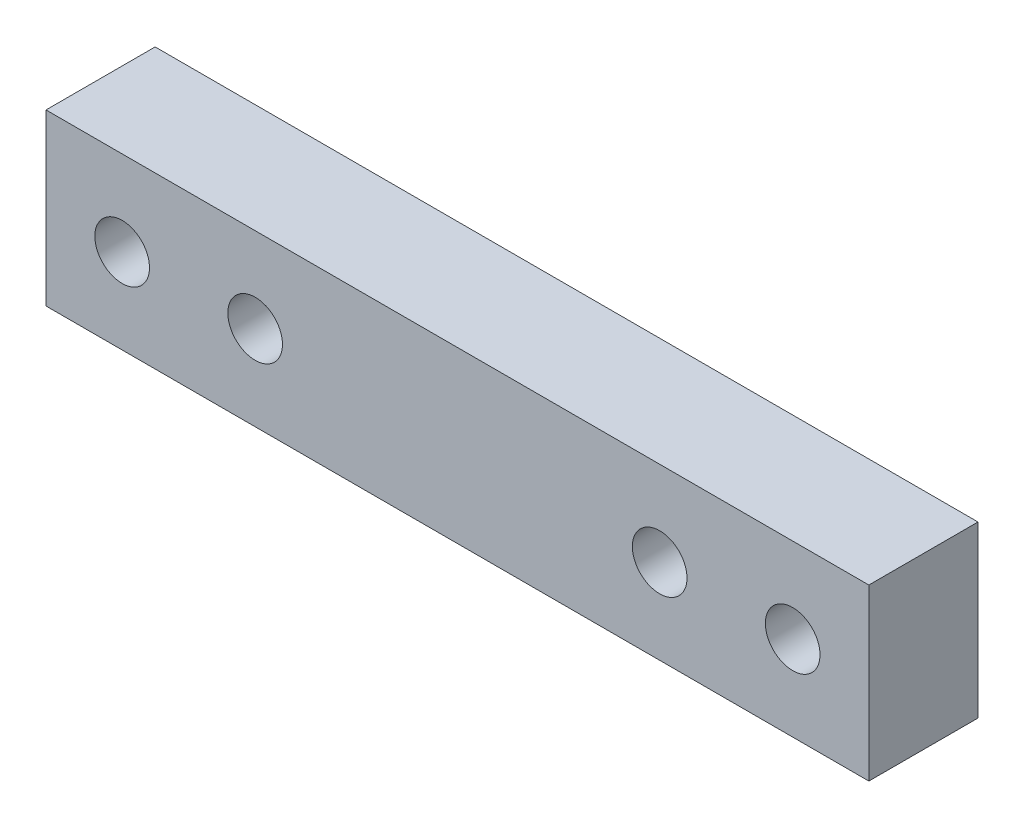
ISO-10303-21;
HEADER;
FILE_DESCRIPTION(('STEP AP214'),'2;1');
FILE_NAME('part.step','',(''),(''),'','','');
FILE_SCHEMA(('AUTOMOTIVE_DESIGN { 1 0 10303 214 1 1 1 1 }'));
ENDSEC;
DATA;
#1=APPLICATION_CONTEXT('core data for automotive mechanical design processes');
#2=APPLICATION_PROTOCOL_DEFINITION('international standard','automotive_design',2000,#1);
#3=PRODUCT_CONTEXT('',#1,'mechanical');
#4=PRODUCT('Part','Part','',(#3));
#5=PRODUCT_RELATED_PRODUCT_CATEGORY('part','',(#4));
#6=PRODUCT_DEFINITION_FORMATION('','',#4);
#7=PRODUCT_DEFINITION_CONTEXT('part definition',#1,'design');
#8=PRODUCT_DEFINITION('design','',#6,#7);
#9=PRODUCT_DEFINITION_SHAPE('','',#8);
#10=(LENGTH_UNIT() NAMED_UNIT(*) SI_UNIT(.MILLI.,.METRE.));
#11=(NAMED_UNIT(*) PLANE_ANGLE_UNIT() SI_UNIT($,.RADIAN.));
#12=(NAMED_UNIT(*) SI_UNIT($,.STERADIAN.) SOLID_ANGLE_UNIT());
#13=UNCERTAINTY_MEASURE_WITH_UNIT(LENGTH_MEASURE(1.E-05),#10,'distance_accuracy_value','');
#14=(GEOMETRIC_REPRESENTATION_CONTEXT(3) GLOBAL_UNCERTAINTY_ASSIGNED_CONTEXT((#13)) GLOBAL_UNIT_ASSIGNED_CONTEXT((#10,
#11,#12)) REPRESENTATION_CONTEXT('',''));
#15=CARTESIAN_POINT('',(0.,0.,0.));
#16=DIRECTION('',(0.,0.,1.));
#17=DIRECTION('',(1.,0.,0.));
#18=AXIS2_PLACEMENT_3D('',#15,#16,#17);
#19=CARTESIAN_POINT('',(0.,0.,5.99));
#20=DIRECTION('',(0.,0.,-1.));
#21=DIRECTION('',(-1.,0.,0.));
#22=AXIS2_PLACEMENT_3D('',#19,#20,#21);
#23=PLANE('',#22);
#24=DIRECTION('',(0.,-1.,0.));
#25=VECTOR('',#24,1.);
#26=CARTESIAN_POINT('',(0.,0.,5.99));
#27=LINE('',#26,#25);
#28=CARTESIAN_POINT('',(0.,9.32,5.99));
#29=VERTEX_POINT('',#28);
#30=CARTESIAN_POINT('',(0.,0.,5.99));
#31=VERTEX_POINT('',#30);
#32=EDGE_CURVE('E85',#29,#31,#27,.T.);
#33=ORIENTED_EDGE('',*,*,#32,.T.);
#34=DIRECTION('',(1.,0.,0.));
#35=VECTOR('',#34,1.);
#36=CARTESIAN_POINT('',(0.,0.,5.99));
#37=LINE('',#36,#35);
#38=CARTESIAN_POINT('',(45.16,0.,5.99));
#39=VERTEX_POINT('',#38);
#40=EDGE_CURVE('E80',#31,#39,#37,.T.);
#41=ORIENTED_EDGE('',*,*,#40,.T.);
#42=DIRECTION('',(0.,1.,0.));
#43=VECTOR('',#42,1.);
#44=CARTESIAN_POINT('',(45.16,0.,5.99));
#45=LINE('',#44,#43);
#46=CARTESIAN_POINT('',(45.16,9.32,5.99));
#47=VERTEX_POINT('',#46);
#48=EDGE_CURVE('E83',#39,#47,#45,.T.);
#49=ORIENTED_EDGE('',*,*,#48,.T.);
#50=DIRECTION('',(-1.,0.,0.));
#51=VECTOR('',#50,1.);
#52=CARTESIAN_POINT('',(0.,9.32,5.99));
#53=LINE('',#52,#51);
#54=EDGE_CURVE('E50',#47,#29,#53,.T.);
#55=ORIENTED_EDGE('',*,*,#54,.T.);
#56=EDGE_LOOP('',(#33,#41,#49,#55));
#57=FACE_BOUND('',#56,.T.);
#58=CARTESIAN_POINT('',(4.18,4.66,5.99));
#59=DIRECTION('',(0.,0.,1.));
#60=DIRECTION('',(1.,0.,0.));
#61=AXIS2_PLACEMENT_3D('',#58,#59,#60);
#62=CIRCLE('',#61,1.5);
#63=CARTESIAN_POINT('',(2.68,4.66,5.99));
#64=VERTEX_POINT('',#63);
#65=EDGE_CURVE('E100',#64,#64,#62,.T.);
#66=ORIENTED_EDGE('',*,*,#65,.F.);
#67=EDGE_LOOP('',(#66));
#68=FACE_BOUND('',#67,.T.);
#69=CARTESIAN_POINT('',(11.48,4.66,5.99));
#70=DIRECTION('',(0.,0.,1.));
#71=DIRECTION('',(1.,0.,0.));
#72=AXIS2_PLACEMENT_3D('',#69,#70,#71);
#73=CIRCLE('',#72,1.5);
#74=CARTESIAN_POINT('',(9.98,4.66,5.99));
#75=VERTEX_POINT('',#74);
#76=EDGE_CURVE('E115',#75,#75,#73,.T.);
#77=ORIENTED_EDGE('',*,*,#76,.F.);
#78=EDGE_LOOP('',(#77));
#79=FACE_BOUND('',#78,.T.);
#80=CARTESIAN_POINT('',(40.98,4.66,5.99));
#81=DIRECTION('',(0.,0.,1.));
#82=DIRECTION('',(-1.,0.,0.));
#83=AXIS2_PLACEMENT_3D('',#80,#81,#82);
#84=CIRCLE('',#83,1.5);
#85=CARTESIAN_POINT('',(39.48,4.66,5.99));
#86=VERTEX_POINT('',#85);
#87=EDGE_CURVE('E121',#86,#86,#84,.T.);
#88=ORIENTED_EDGE('',*,*,#87,.F.);
#89=EDGE_LOOP('',(#88));
#90=FACE_BOUND('',#89,.T.);
#91=CARTESIAN_POINT('',(33.68,4.66,5.99));
#92=DIRECTION('',(0.,0.,1.));
#93=DIRECTION('',(-1.,0.,0.));
#94=AXIS2_PLACEMENT_3D('',#91,#92,#93);
#95=CIRCLE('',#94,1.5);
#96=CARTESIAN_POINT('',(32.18,4.66,5.99));
#97=VERTEX_POINT('',#96);
#98=EDGE_CURVE('E127',#97,#97,#95,.T.);
#99=ORIENTED_EDGE('',*,*,#98,.F.);
#100=EDGE_LOOP('',(#99));
#101=FACE_BOUND('',#100,.T.);
#102=ADVANCED_FACE('F33',(#57,#68,#79,#90,#101),#23,.F.);
#103=CARTESIAN_POINT('',(0.,0.,0.));
#104=DIRECTION('',(0.,0.,-1.));
#105=DIRECTION('',(-1.,0.,0.));
#106=AXIS2_PLACEMENT_3D('',#103,#104,#105);
#107=PLANE('',#106);
#108=CARTESIAN_POINT('',(40.98,4.66,0.));
#109=DIRECTION('',(0.,0.,1.));
#110=DIRECTION('',(-1.,0.,0.));
#111=AXIS2_PLACEMENT_3D('',#108,#109,#110);
#112=CIRCLE('',#111,1.5);
#113=CARTESIAN_POINT('',(39.48,4.66,0.));
#114=VERTEX_POINT('',#113);
#115=EDGE_CURVE('E124',#114,#114,#112,.T.);
#116=ORIENTED_EDGE('',*,*,#115,.T.);
#117=EDGE_LOOP('',(#116));
#118=FACE_BOUND('',#117,.T.);
#119=CARTESIAN_POINT('',(4.18,4.66,0.));
#120=DIRECTION('',(0.,0.,1.));
#121=DIRECTION('',(1.,0.,0.));
#122=AXIS2_PLACEMENT_3D('',#119,#120,#121);
#123=CIRCLE('',#122,1.5);
#124=CARTESIAN_POINT('',(2.68,4.66,0.));
#125=VERTEX_POINT('',#124);
#126=EDGE_CURVE('E112',#125,#125,#123,.T.);
#127=ORIENTED_EDGE('',*,*,#126,.T.);
#128=EDGE_LOOP('',(#127));
#129=FACE_BOUND('',#128,.T.);
#130=DIRECTION('',(0.,-1.,0.));
#131=VECTOR('',#130,1.);
#132=CARTESIAN_POINT('',(0.,0.,0.));
#133=LINE('',#132,#131);
#134=CARTESIAN_POINT('',(0.,9.32,0.));
#135=VERTEX_POINT('',#134);
#136=CARTESIAN_POINT('',(0.,0.,0.));
#137=VERTEX_POINT('',#136);
#138=EDGE_CURVE('E97',#135,#137,#133,.T.);
#139=ORIENTED_EDGE('',*,*,#138,.F.);
#140=DIRECTION('',(-1.,0.,0.));
#141=VECTOR('',#140,1.);
#142=CARTESIAN_POINT('',(0.,9.32,0.));
#143=LINE('',#142,#141);
#144=CARTESIAN_POINT('',(45.16,9.32,0.));
#145=VERTEX_POINT('',#144);
#146=EDGE_CURVE('E73',#145,#135,#143,.T.);
#147=ORIENTED_EDGE('',*,*,#146,.F.);
#148=DIRECTION('',(0.,1.,0.));
#149=VECTOR('',#148,1.);
#150=CARTESIAN_POINT('',(45.16,0.,0.));
#151=LINE('',#150,#149);
#152=CARTESIAN_POINT('',(45.16,0.,0.));
#153=VERTEX_POINT('',#152);
#154=EDGE_CURVE('E67',#153,#145,#151,.T.);
#155=ORIENTED_EDGE('',*,*,#154,.F.);
#156=DIRECTION('',(1.,0.,0.));
#157=VECTOR('',#156,1.);
#158=CARTESIAN_POINT('',(0.,0.,0.));
#159=LINE('',#158,#157);
#160=EDGE_CURVE('E89',#137,#153,#159,.T.);
#161=ORIENTED_EDGE('',*,*,#160,.F.);
#162=EDGE_LOOP('',(#139,#147,#155,#161));
#163=FACE_BOUND('',#162,.T.);
#164=CARTESIAN_POINT('',(11.48,4.66,0.));
#165=DIRECTION('',(0.,0.,1.));
#166=DIRECTION('',(1.,0.,0.));
#167=AXIS2_PLACEMENT_3D('',#164,#165,#166);
#168=CIRCLE('',#167,1.5);
#169=CARTESIAN_POINT('',(9.98,4.66,0.));
#170=VERTEX_POINT('',#169);
#171=EDGE_CURVE('E118',#170,#170,#168,.T.);
#172=ORIENTED_EDGE('',*,*,#171,.T.);
#173=EDGE_LOOP('',(#172));
#174=FACE_BOUND('',#173,.T.);
#175=CARTESIAN_POINT('',(33.68,4.66,0.));
#176=DIRECTION('',(0.,0.,1.));
#177=DIRECTION('',(-1.,0.,0.));
#178=AXIS2_PLACEMENT_3D('',#175,#176,#177);
#179=CIRCLE('',#178,1.5);
#180=CARTESIAN_POINT('',(32.18,4.66,0.));
#181=VERTEX_POINT('',#180);
#182=EDGE_CURVE('E130',#181,#181,#179,.T.);
#183=ORIENTED_EDGE('',*,*,#182,.T.);
#184=EDGE_LOOP('',(#183));
#185=FACE_BOUND('',#184,.T.);
#186=ADVANCED_FACE('F108',(#118,#129,#163,#174,#185),#107,.T.);
#187=CARTESIAN_POINT('',(0.,0.,5.99));
#188=DIRECTION('',(1.,0.,0.));
#189=DIRECTION('',(0.,0.,-1.));
#190=AXIS2_PLACEMENT_3D('',#187,#188,#189);
#191=PLANE('',#190);
#192=ORIENTED_EDGE('',*,*,#138,.T.);
#193=DIRECTION('',(0.,0.,-1.));
#194=VECTOR('',#193,1.);
#195=CARTESIAN_POINT('',(0.,0.,5.99));
#196=LINE('',#195,#194);
#197=EDGE_CURVE('E11',#31,#137,#196,.T.);
#198=ORIENTED_EDGE('',*,*,#197,.F.);
#199=ORIENTED_EDGE('',*,*,#32,.F.);
#200=DIRECTION('',(0.,0.,-1.));
#201=VECTOR('',#200,1.);
#202=CARTESIAN_POINT('',(0.,9.32,5.99));
#203=LINE('',#202,#201);
#204=EDGE_CURVE('E93',#29,#135,#203,.T.);
#205=ORIENTED_EDGE('',*,*,#204,.T.);
#206=EDGE_LOOP('',(#192,#198,#199,#205));
#207=FACE_BOUND('',#206,.T.);
#208=ADVANCED_FACE('F35',(#207),#191,.F.);
#209=CARTESIAN_POINT('',(0.,0.,5.99));
#210=DIRECTION('',(0.,1.,0.));
#211=DIRECTION('',(0.,0.,1.));
#212=AXIS2_PLACEMENT_3D('',#209,#210,#211);
#213=PLANE('',#212);
#214=ORIENTED_EDGE('',*,*,#160,.T.);
#215=DIRECTION('',(0.,0.,-1.));
#216=VECTOR('',#215,1.);
#217=CARTESIAN_POINT('',(45.16,0.,5.99));
#218=LINE('',#217,#216);
#219=EDGE_CURVE('E42',#39,#153,#218,.T.);
#220=ORIENTED_EDGE('',*,*,#219,.F.);
#221=ORIENTED_EDGE('',*,*,#40,.F.);
#222=ORIENTED_EDGE('',*,*,#197,.T.);
#223=EDGE_LOOP('',(#214,#220,#221,#222));
#224=FACE_BOUND('',#223,.T.);
#225=ADVANCED_FACE('F88',(#224),#213,.F.);
#226=CARTESIAN_POINT('',(45.16,0.,5.99));
#227=DIRECTION('',(-1.,0.,0.));
#228=DIRECTION('',(0.,0.,1.));
#229=AXIS2_PLACEMENT_3D('',#226,#227,#228);
#230=PLANE('',#229);
#231=ORIENTED_EDGE('',*,*,#154,.T.);
#232=DIRECTION('',(0.,0.,-1.));
#233=VECTOR('',#232,1.);
#234=CARTESIAN_POINT('',(45.16,9.32,5.99));
#235=LINE('',#234,#233);
#236=EDGE_CURVE('E90',#47,#145,#235,.T.);
#237=ORIENTED_EDGE('',*,*,#236,.F.);
#238=ORIENTED_EDGE('',*,*,#48,.F.);
#239=ORIENTED_EDGE('',*,*,#219,.T.);
#240=EDGE_LOOP('',(#231,#237,#238,#239));
#241=FACE_BOUND('',#240,.T.);
#242=ADVANCED_FACE('F91',(#241),#230,.F.);
#243=CARTESIAN_POINT('',(0.,9.32,5.99));
#244=DIRECTION('',(0.,-1.,0.));
#245=DIRECTION('',(0.,0.,-1.));
#246=AXIS2_PLACEMENT_3D('',#243,#244,#245);
#247=PLANE('',#246);
#248=ORIENTED_EDGE('',*,*,#146,.T.);
#249=ORIENTED_EDGE('',*,*,#204,.F.);
#250=ORIENTED_EDGE('',*,*,#54,.F.);
#251=ORIENTED_EDGE('',*,*,#236,.T.);
#252=EDGE_LOOP('',(#248,#249,#250,#251));
#253=FACE_BOUND('',#252,.T.);
#254=ADVANCED_FACE('F105',(#253),#247,.F.);
#255=CARTESIAN_POINT('',(4.18,4.66,5.99));
#256=DIRECTION('',(0.,0.,-1.));
#257=DIRECTION('',(-1.,0.,0.));
#258=AXIS2_PLACEMENT_3D('',#255,#256,#257);
#259=CYLINDRICAL_SURFACE('',#258,1.5);
#260=CARTESIAN_POINT('',(2.68,4.66,5.99));
#261=CARTESIAN_POINT('',(2.68,4.66,5.92760416666667));
#262=CARTESIAN_POINT('',(2.68,4.66,5.86520833333333));
#263=CARTESIAN_POINT('',(2.68,4.66,5.74041666666667));
#264=CARTESIAN_POINT('',(2.68,4.66,5.67802083333333));
#265=CARTESIAN_POINT('',(2.68,4.66,5.55322916666667));
#266=CARTESIAN_POINT('',(2.68,4.66,5.49083333333333));
#267=CARTESIAN_POINT('',(2.68,4.66,5.36604166666667));
#268=CARTESIAN_POINT('',(2.68,4.66,5.30364583333333));
#269=CARTESIAN_POINT('',(2.68,4.66,5.17885416666667));
#270=CARTESIAN_POINT('',(2.68,4.66,5.11645833333333));
#271=CARTESIAN_POINT('',(2.68,4.66,4.99166666666667));
#272=CARTESIAN_POINT('',(2.68,4.66,4.92927083333333));
#273=CARTESIAN_POINT('',(2.68,4.66,4.80447916666667));
#274=CARTESIAN_POINT('',(2.68,4.66,4.74208333333333));
#275=CARTESIAN_POINT('',(2.68,4.66,4.61729166666667));
#276=CARTESIAN_POINT('',(2.68,4.66,4.55489583333333));
#277=CARTESIAN_POINT('',(2.68,4.66,4.43010416666667));
#278=CARTESIAN_POINT('',(2.68,4.66,4.36770833333333));
#279=CARTESIAN_POINT('',(2.68,4.66,4.24291666666667));
#280=CARTESIAN_POINT('',(2.68,4.66,4.18052083333333));
#281=CARTESIAN_POINT('',(2.68,4.66,4.05572916666667));
#282=CARTESIAN_POINT('',(2.68,4.66,3.99333333333333));
#283=CARTESIAN_POINT('',(2.68,4.66,3.86854166666667));
#284=CARTESIAN_POINT('',(2.68,4.66,3.80614583333333));
#285=CARTESIAN_POINT('',(2.68,4.66,3.68135416666667));
#286=CARTESIAN_POINT('',(2.68,4.66,3.61895833333333));
#287=CARTESIAN_POINT('',(2.68,4.66,3.49416666666667));
#288=CARTESIAN_POINT('',(2.68,4.66,3.43177083333333));
#289=CARTESIAN_POINT('',(2.68,4.66,3.30697916666667));
#290=CARTESIAN_POINT('',(2.68,4.66,3.24458333333333));
#291=CARTESIAN_POINT('',(2.68,4.66,3.11979166666667));
#292=CARTESIAN_POINT('',(2.68,4.66,3.05739583333333));
#293=CARTESIAN_POINT('',(2.68,4.66,2.93260416666667));
#294=CARTESIAN_POINT('',(2.68,4.66,2.87020833333333));
#295=CARTESIAN_POINT('',(2.68,4.66,2.74541666666667));
#296=CARTESIAN_POINT('',(2.68,4.66,2.68302083333333));
#297=CARTESIAN_POINT('',(2.68,4.66,2.55822916666667));
#298=CARTESIAN_POINT('',(2.68,4.66,2.49583333333333));
#299=CARTESIAN_POINT('',(2.68,4.66,2.37104166666667));
#300=CARTESIAN_POINT('',(2.68,4.66,2.30864583333333));
#301=CARTESIAN_POINT('',(2.68,4.66,2.18385416666667));
#302=CARTESIAN_POINT('',(2.68,4.66,2.12145833333333));
#303=CARTESIAN_POINT('',(2.68,4.66,1.99666666666667));
#304=CARTESIAN_POINT('',(2.68,4.66,1.93427083333333));
#305=CARTESIAN_POINT('',(2.68,4.66,1.80947916666667));
#306=CARTESIAN_POINT('',(2.68,4.66,1.74708333333333));
#307=CARTESIAN_POINT('',(2.68,4.66,1.62229166666667));
#308=CARTESIAN_POINT('',(2.68,4.66,1.55989583333333));
#309=CARTESIAN_POINT('',(2.68,4.66,1.43510416666667));
#310=CARTESIAN_POINT('',(2.68,4.66,1.37270833333333));
#311=CARTESIAN_POINT('',(2.68,4.66,1.24791666666667));
#312=CARTESIAN_POINT('',(2.68,4.66,1.18552083333333));
#313=CARTESIAN_POINT('',(2.68,4.66,1.06072916666667));
#314=CARTESIAN_POINT('',(2.68,4.66,0.998333333333333));
#315=CARTESIAN_POINT('',(2.68,4.66,0.873541666666666));
#316=CARTESIAN_POINT('',(2.68,4.66,0.811145833333333));
#317=CARTESIAN_POINT('',(2.68,4.66,0.686354166666666));
#318=CARTESIAN_POINT('',(2.68,4.66,0.623958333333333));
#319=CARTESIAN_POINT('',(2.68,4.66,0.499166666666666));
#320=CARTESIAN_POINT('',(2.68,4.66,0.436770833333332));
#321=CARTESIAN_POINT('',(2.68,4.66,0.311979166666666));
#322=CARTESIAN_POINT('',(2.68,4.66,0.249583333333332));
#323=CARTESIAN_POINT('',(2.68,4.66,0.124791666666666));
#324=CARTESIAN_POINT('',(2.68,4.66,0.0623958333333325));
#325=CARTESIAN_POINT('',(2.68,4.66,0.));
#326=B_SPLINE_CURVE_WITH_KNOTS('',3,(#260,#261,#262,#263,#264,#265,#266,#267,#268,#269,#270,
#271,#272,#273,#274,#275,#276,#277,#278,#279,#280,#281,#282,#283,#284,#285,#286,#287,#288,#289,
#290,#291,#292,#293,#294,#295,#296,#297,#298,#299,#300,#301,#302,#303,#304,#305,#306,#307,#308,
#309,#310,#311,#312,#313,#314,#315,#316,#317,#318,#319,#320,#321,#322,#323,#324,#325),
.UNSPECIFIED.,.F.,.F.,(4,2,2,2,2,2,2,2,2,2,2,2,2,2,2,2,2,2,2,2,2,2,2,2,2,2,2,2,2,2,2,2,4),(0.,
0.187187500000001,0.374375000000001,0.5615625,0.74875,0.935937500000001,1.123125,1.3103125,
1.4975,1.6846875,1.871875,2.0590625,2.24625,2.4334375,2.620625,2.8078125,2.995,3.1821875,
3.369375,3.5565625,3.74375,3.9309375,4.118125,4.3053125,4.4925,4.6796875,4.866875,5.0540625,
5.24125,5.4284375,5.615625,5.8028125,5.99),.UNSPECIFIED.);
#327=EDGE_CURVE('BSEAM147',#64,#125,#326,.T.);
#328=ORIENTED_EDGE('',*,*,#65,.T.);
#329=ORIENTED_EDGE('',*,*,#126,.F.);
#330=ORIENTED_EDGE('',*,*,#327,.T.);
#331=ORIENTED_EDGE('',*,*,#327,.F.);
#332=EDGE_LOOP('',(#328,#330,#329,#331));
#333=FACE_BOUND('',#332,.T.);
#334=ADVANCED_FACE('F147',(#333),#259,.F.);
#335=CARTESIAN_POINT('',(11.48,4.66,5.99));
#336=DIRECTION('',(0.,0.,-1.));
#337=DIRECTION('',(-1.,0.,0.));
#338=AXIS2_PLACEMENT_3D('',#335,#336,#337);
#339=CYLINDRICAL_SURFACE('',#338,1.5);
#340=CARTESIAN_POINT('',(9.98,4.66,5.99));
#341=CARTESIAN_POINT('',(9.98,4.66,5.92760416666667));
#342=CARTESIAN_POINT('',(9.98,4.66,5.86520833333333));
#343=CARTESIAN_POINT('',(9.98,4.66,5.74041666666667));
#344=CARTESIAN_POINT('',(9.98,4.66,5.67802083333333));
#345=CARTESIAN_POINT('',(9.98,4.66,5.55322916666667));
#346=CARTESIAN_POINT('',(9.98,4.66,5.49083333333333));
#347=CARTESIAN_POINT('',(9.98,4.66,5.36604166666667));
#348=CARTESIAN_POINT('',(9.98,4.66,5.30364583333333));
#349=CARTESIAN_POINT('',(9.98,4.66,5.17885416666667));
#350=CARTESIAN_POINT('',(9.98,4.66,5.11645833333333));
#351=CARTESIAN_POINT('',(9.98,4.66,4.99166666666667));
#352=CARTESIAN_POINT('',(9.98,4.66,4.92927083333333));
#353=CARTESIAN_POINT('',(9.98,4.66,4.80447916666667));
#354=CARTESIAN_POINT('',(9.98,4.66,4.74208333333333));
#355=CARTESIAN_POINT('',(9.98,4.66,4.61729166666667));
#356=CARTESIAN_POINT('',(9.98,4.66,4.55489583333333));
#357=CARTESIAN_POINT('',(9.98,4.66,4.43010416666667));
#358=CARTESIAN_POINT('',(9.98,4.66,4.36770833333333));
#359=CARTESIAN_POINT('',(9.98,4.66,4.24291666666667));
#360=CARTESIAN_POINT('',(9.98,4.66,4.18052083333333));
#361=CARTESIAN_POINT('',(9.98,4.66,4.05572916666667));
#362=CARTESIAN_POINT('',(9.98,4.66,3.99333333333333));
#363=CARTESIAN_POINT('',(9.98,4.66,3.86854166666667));
#364=CARTESIAN_POINT('',(9.98,4.66,3.80614583333333));
#365=CARTESIAN_POINT('',(9.98,4.66,3.68135416666667));
#366=CARTESIAN_POINT('',(9.98,4.66,3.61895833333333));
#367=CARTESIAN_POINT('',(9.98,4.66,3.49416666666667));
#368=CARTESIAN_POINT('',(9.98,4.66,3.43177083333333));
#369=CARTESIAN_POINT('',(9.98,4.66,3.30697916666667));
#370=CARTESIAN_POINT('',(9.98,4.66,3.24458333333333));
#371=CARTESIAN_POINT('',(9.98,4.66,3.11979166666667));
#372=CARTESIAN_POINT('',(9.98,4.66,3.05739583333333));
#373=CARTESIAN_POINT('',(9.98,4.66,2.93260416666667));
#374=CARTESIAN_POINT('',(9.98,4.66,2.87020833333333));
#375=CARTESIAN_POINT('',(9.98,4.66,2.74541666666667));
#376=CARTESIAN_POINT('',(9.98,4.66,2.68302083333333));
#377=CARTESIAN_POINT('',(9.98,4.66,2.55822916666667));
#378=CARTESIAN_POINT('',(9.98,4.66,2.49583333333333));
#379=CARTESIAN_POINT('',(9.98,4.66,2.37104166666667));
#380=CARTESIAN_POINT('',(9.98,4.66,2.30864583333333));
#381=CARTESIAN_POINT('',(9.98,4.66,2.18385416666667));
#382=CARTESIAN_POINT('',(9.98,4.66,2.12145833333333));
#383=CARTESIAN_POINT('',(9.98,4.66,1.99666666666667));
#384=CARTESIAN_POINT('',(9.98,4.66,1.93427083333333));
#385=CARTESIAN_POINT('',(9.98,4.66,1.80947916666667));
#386=CARTESIAN_POINT('',(9.98,4.66,1.74708333333333));
#387=CARTESIAN_POINT('',(9.98,4.66,1.62229166666667));
#388=CARTESIAN_POINT('',(9.98,4.66,1.55989583333333));
#389=CARTESIAN_POINT('',(9.98,4.66,1.43510416666667));
#390=CARTESIAN_POINT('',(9.98,4.66,1.37270833333333));
#391=CARTESIAN_POINT('',(9.98,4.66,1.24791666666667));
#392=CARTESIAN_POINT('',(9.98,4.66,1.18552083333333));
#393=CARTESIAN_POINT('',(9.98,4.66,1.06072916666667));
#394=CARTESIAN_POINT('',(9.98,4.66,0.998333333333333));
#395=CARTESIAN_POINT('',(9.98,4.66,0.873541666666666));
#396=CARTESIAN_POINT('',(9.98,4.66,0.811145833333333));
#397=CARTESIAN_POINT('',(9.98,4.66,0.686354166666666));
#398=CARTESIAN_POINT('',(9.98,4.66,0.623958333333333));
#399=CARTESIAN_POINT('',(9.98,4.66,0.499166666666666));
#400=CARTESIAN_POINT('',(9.98,4.66,0.436770833333332));
#401=CARTESIAN_POINT('',(9.98,4.66,0.311979166666666));
#402=CARTESIAN_POINT('',(9.98,4.66,0.249583333333332));
#403=CARTESIAN_POINT('',(9.98,4.66,0.124791666666666));
#404=CARTESIAN_POINT('',(9.98,4.66,0.0623958333333325));
#405=CARTESIAN_POINT('',(9.98,4.66,0.));
#406=B_SPLINE_CURVE_WITH_KNOTS('',3,(#340,#341,#342,#343,#344,#345,#346,#347,#348,#349,#350,
#351,#352,#353,#354,#355,#356,#357,#358,#359,#360,#361,#362,#363,#364,#365,#366,#367,#368,#369,
#370,#371,#372,#373,#374,#375,#376,#377,#378,#379,#380,#381,#382,#383,#384,#385,#386,#387,#388,
#389,#390,#391,#392,#393,#394,#395,#396,#397,#398,#399,#400,#401,#402,#403,#404,#405),
.UNSPECIFIED.,.F.,.F.,(4,2,2,2,2,2,2,2,2,2,2,2,2,2,2,2,2,2,2,2,2,2,2,2,2,2,2,2,2,2,2,2,4),(0.,
0.187187500000001,0.374375000000001,0.5615625,0.74875,0.935937500000001,1.123125,1.3103125,
1.4975,1.6846875,1.871875,2.0590625,2.24625,2.4334375,2.620625,2.8078125,2.995,3.1821875,
3.369375,3.5565625,3.74375,3.9309375,4.118125,4.3053125,4.4925,4.6796875,4.866875,5.0540625,
5.24125,5.4284375,5.615625,5.8028125,5.99),.UNSPECIFIED.);
#407=EDGE_CURVE('BSEAM193',#75,#170,#406,.T.);
#408=ORIENTED_EDGE('',*,*,#76,.T.);
#409=ORIENTED_EDGE('',*,*,#171,.F.);
#410=ORIENTED_EDGE('',*,*,#407,.T.);
#411=ORIENTED_EDGE('',*,*,#407,.F.);
#412=EDGE_LOOP('',(#408,#410,#409,#411));
#413=FACE_BOUND('',#412,.T.);
#414=ADVANCED_FACE('F193',(#413),#339,.F.);
#415=CARTESIAN_POINT('',(40.98,4.66,5.99));
#416=DIRECTION('',(0.,0.,-1.));
#417=DIRECTION('',(-1.,0.,0.));
#418=AXIS2_PLACEMENT_3D('',#415,#416,#417);
#419=CYLINDRICAL_SURFACE('',#418,1.5);
#420=CARTESIAN_POINT('',(39.48,4.66,5.99));
#421=CARTESIAN_POINT('',(39.48,4.66,5.92760416666667));
#422=CARTESIAN_POINT('',(39.48,4.66,5.86520833333333));
#423=CARTESIAN_POINT('',(39.48,4.66,5.74041666666667));
#424=CARTESIAN_POINT('',(39.48,4.66,5.67802083333333));
#425=CARTESIAN_POINT('',(39.48,4.66,5.55322916666667));
#426=CARTESIAN_POINT('',(39.48,4.66,5.49083333333333));
#427=CARTESIAN_POINT('',(39.48,4.66,5.36604166666667));
#428=CARTESIAN_POINT('',(39.48,4.66,5.30364583333333));
#429=CARTESIAN_POINT('',(39.48,4.66,5.17885416666667));
#430=CARTESIAN_POINT('',(39.48,4.66,5.11645833333333));
#431=CARTESIAN_POINT('',(39.48,4.66,4.99166666666667));
#432=CARTESIAN_POINT('',(39.48,4.66,4.92927083333333));
#433=CARTESIAN_POINT('',(39.48,4.66,4.80447916666667));
#434=CARTESIAN_POINT('',(39.48,4.66,4.74208333333333));
#435=CARTESIAN_POINT('',(39.48,4.66,4.61729166666667));
#436=CARTESIAN_POINT('',(39.48,4.66,4.55489583333333));
#437=CARTESIAN_POINT('',(39.48,4.66,4.43010416666667));
#438=CARTESIAN_POINT('',(39.48,4.66,4.36770833333333));
#439=CARTESIAN_POINT('',(39.48,4.66,4.24291666666667));
#440=CARTESIAN_POINT('',(39.48,4.66,4.18052083333333));
#441=CARTESIAN_POINT('',(39.48,4.66,4.05572916666667));
#442=CARTESIAN_POINT('',(39.48,4.66,3.99333333333333));
#443=CARTESIAN_POINT('',(39.48,4.66,3.86854166666667));
#444=CARTESIAN_POINT('',(39.48,4.66,3.80614583333333));
#445=CARTESIAN_POINT('',(39.48,4.66,3.68135416666667));
#446=CARTESIAN_POINT('',(39.48,4.66,3.61895833333333));
#447=CARTESIAN_POINT('',(39.48,4.66,3.49416666666667));
#448=CARTESIAN_POINT('',(39.48,4.66,3.43177083333333));
#449=CARTESIAN_POINT('',(39.48,4.66,3.30697916666667));
#450=CARTESIAN_POINT('',(39.48,4.66,3.24458333333333));
#451=CARTESIAN_POINT('',(39.48,4.66,3.11979166666667));
#452=CARTESIAN_POINT('',(39.48,4.66,3.05739583333333));
#453=CARTESIAN_POINT('',(39.48,4.66,2.93260416666667));
#454=CARTESIAN_POINT('',(39.48,4.66,2.87020833333333));
#455=CARTESIAN_POINT('',(39.48,4.66,2.74541666666667));
#456=CARTESIAN_POINT('',(39.48,4.66,2.68302083333333));
#457=CARTESIAN_POINT('',(39.48,4.66,2.55822916666667));
#458=CARTESIAN_POINT('',(39.48,4.66,2.49583333333333));
#459=CARTESIAN_POINT('',(39.48,4.66,2.37104166666667));
#460=CARTESIAN_POINT('',(39.48,4.66,2.30864583333333));
#461=CARTESIAN_POINT('',(39.48,4.66,2.18385416666667));
#462=CARTESIAN_POINT('',(39.48,4.66,2.12145833333333));
#463=CARTESIAN_POINT('',(39.48,4.66,1.99666666666667));
#464=CARTESIAN_POINT('',(39.48,4.66,1.93427083333333));
#465=CARTESIAN_POINT('',(39.48,4.66,1.80947916666667));
#466=CARTESIAN_POINT('',(39.48,4.66,1.74708333333333));
#467=CARTESIAN_POINT('',(39.48,4.66,1.62229166666667));
#468=CARTESIAN_POINT('',(39.48,4.66,1.55989583333333));
#469=CARTESIAN_POINT('',(39.48,4.66,1.43510416666667));
#470=CARTESIAN_POINT('',(39.48,4.66,1.37270833333333));
#471=CARTESIAN_POINT('',(39.48,4.66,1.24791666666667));
#472=CARTESIAN_POINT('',(39.48,4.66,1.18552083333333));
#473=CARTESIAN_POINT('',(39.48,4.66,1.06072916666667));
#474=CARTESIAN_POINT('',(39.48,4.66,0.998333333333333));
#475=CARTESIAN_POINT('',(39.48,4.66,0.873541666666666));
#476=CARTESIAN_POINT('',(39.48,4.66,0.811145833333333));
#477=CARTESIAN_POINT('',(39.48,4.66,0.686354166666666));
#478=CARTESIAN_POINT('',(39.48,4.66,0.623958333333333));
#479=CARTESIAN_POINT('',(39.48,4.66,0.499166666666666));
#480=CARTESIAN_POINT('',(39.48,4.66,0.436770833333332));
#481=CARTESIAN_POINT('',(39.48,4.66,0.311979166666666));
#482=CARTESIAN_POINT('',(39.48,4.66,0.249583333333332));
#483=CARTESIAN_POINT('',(39.48,4.66,0.124791666666666));
#484=CARTESIAN_POINT('',(39.48,4.66,0.0623958333333325));
#485=CARTESIAN_POINT('',(39.48,4.66,0.));
#486=B_SPLINE_CURVE_WITH_KNOTS('',3,(#420,#421,#422,#423,#424,#425,#426,#427,#428,#429,#430,
#431,#432,#433,#434,#435,#436,#437,#438,#439,#440,#441,#442,#443,#444,#445,#446,#447,#448,#449,
#450,#451,#452,#453,#454,#455,#456,#457,#458,#459,#460,#461,#462,#463,#464,#465,#466,#467,#468,
#469,#470,#471,#472,#473,#474,#475,#476,#477,#478,#479,#480,#481,#482,#483,#484,#485),
.UNSPECIFIED.,.F.,.F.,(4,2,2,2,2,2,2,2,2,2,2,2,2,2,2,2,2,2,2,2,2,2,2,2,2,2,2,2,2,2,2,2,4),(0.,
0.187187500000001,0.374375000000001,0.5615625,0.74875,0.935937500000001,1.123125,1.3103125,
1.4975,1.6846875,1.871875,2.0590625,2.24625,2.4334375,2.620625,2.8078125,2.995,3.1821875,
3.369375,3.5565625,3.74375,3.9309375,4.118125,4.3053125,4.4925,4.6796875,4.866875,5.0540625,
5.24125,5.4284375,5.615625,5.8028125,5.99),.UNSPECIFIED.);
#487=EDGE_CURVE('BSEAM201',#86,#114,#486,.T.);
#488=ORIENTED_EDGE('',*,*,#87,.T.);
#489=ORIENTED_EDGE('',*,*,#115,.F.);
#490=ORIENTED_EDGE('',*,*,#487,.T.);
#491=ORIENTED_EDGE('',*,*,#487,.F.);
#492=EDGE_LOOP('',(#488,#490,#489,#491));
#493=FACE_BOUND('',#492,.T.);
#494=ADVANCED_FACE('F201',(#493),#419,.F.);
#495=CARTESIAN_POINT('',(33.68,4.66,5.99));
#496=DIRECTION('',(0.,0.,-1.));
#497=DIRECTION('',(-1.,0.,0.));
#498=AXIS2_PLACEMENT_3D('',#495,#496,#497);
#499=CYLINDRICAL_SURFACE('',#498,1.5);
#500=CARTESIAN_POINT('',(32.18,4.66,5.99));
#501=CARTESIAN_POINT('',(32.18,4.66,5.92760416666667));
#502=CARTESIAN_POINT('',(32.18,4.66,5.86520833333333));
#503=CARTESIAN_POINT('',(32.18,4.66,5.74041666666667));
#504=CARTESIAN_POINT('',(32.18,4.66,5.67802083333333));
#505=CARTESIAN_POINT('',(32.18,4.66,5.55322916666667));
#506=CARTESIAN_POINT('',(32.18,4.66,5.49083333333333));
#507=CARTESIAN_POINT('',(32.18,4.66,5.36604166666667));
#508=CARTESIAN_POINT('',(32.18,4.66,5.30364583333333));
#509=CARTESIAN_POINT('',(32.18,4.66,5.17885416666667));
#510=CARTESIAN_POINT('',(32.18,4.66,5.11645833333333));
#511=CARTESIAN_POINT('',(32.18,4.66,4.99166666666667));
#512=CARTESIAN_POINT('',(32.18,4.66,4.92927083333333));
#513=CARTESIAN_POINT('',(32.18,4.66,4.80447916666667));
#514=CARTESIAN_POINT('',(32.18,4.66,4.74208333333333));
#515=CARTESIAN_POINT('',(32.18,4.66,4.61729166666667));
#516=CARTESIAN_POINT('',(32.18,4.66,4.55489583333333));
#517=CARTESIAN_POINT('',(32.18,4.66,4.43010416666667));
#518=CARTESIAN_POINT('',(32.18,4.66,4.36770833333333));
#519=CARTESIAN_POINT('',(32.18,4.66,4.24291666666667));
#520=CARTESIAN_POINT('',(32.18,4.66,4.18052083333333));
#521=CARTESIAN_POINT('',(32.18,4.66,4.05572916666667));
#522=CARTESIAN_POINT('',(32.18,4.66,3.99333333333333));
#523=CARTESIAN_POINT('',(32.18,4.66,3.86854166666667));
#524=CARTESIAN_POINT('',(32.18,4.66,3.80614583333333));
#525=CARTESIAN_POINT('',(32.18,4.66,3.68135416666667));
#526=CARTESIAN_POINT('',(32.18,4.66,3.61895833333333));
#527=CARTESIAN_POINT('',(32.18,4.66,3.49416666666667));
#528=CARTESIAN_POINT('',(32.18,4.66,3.43177083333333));
#529=CARTESIAN_POINT('',(32.18,4.66,3.30697916666667));
#530=CARTESIAN_POINT('',(32.18,4.66,3.24458333333333));
#531=CARTESIAN_POINT('',(32.18,4.66,3.11979166666667));
#532=CARTESIAN_POINT('',(32.18,4.66,3.05739583333333));
#533=CARTESIAN_POINT('',(32.18,4.66,2.93260416666667));
#534=CARTESIAN_POINT('',(32.18,4.66,2.87020833333333));
#535=CARTESIAN_POINT('',(32.18,4.66,2.74541666666667));
#536=CARTESIAN_POINT('',(32.18,4.66,2.68302083333333));
#537=CARTESIAN_POINT('',(32.18,4.66,2.55822916666667));
#538=CARTESIAN_POINT('',(32.18,4.66,2.49583333333333));
#539=CARTESIAN_POINT('',(32.18,4.66,2.37104166666667));
#540=CARTESIAN_POINT('',(32.18,4.66,2.30864583333333));
#541=CARTESIAN_POINT('',(32.18,4.66,2.18385416666667));
#542=CARTESIAN_POINT('',(32.18,4.66,2.12145833333333));
#543=CARTESIAN_POINT('',(32.18,4.66,1.99666666666667));
#544=CARTESIAN_POINT('',(32.18,4.66,1.93427083333333));
#545=CARTESIAN_POINT('',(32.18,4.66,1.80947916666667));
#546=CARTESIAN_POINT('',(32.18,4.66,1.74708333333333));
#547=CARTESIAN_POINT('',(32.18,4.66,1.62229166666667));
#548=CARTESIAN_POINT('',(32.18,4.66,1.55989583333333));
#549=CARTESIAN_POINT('',(32.18,4.66,1.43510416666667));
#550=CARTESIAN_POINT('',(32.18,4.66,1.37270833333333));
#551=CARTESIAN_POINT('',(32.18,4.66,1.24791666666667));
#552=CARTESIAN_POINT('',(32.18,4.66,1.18552083333333));
#553=CARTESIAN_POINT('',(32.18,4.66,1.06072916666667));
#554=CARTESIAN_POINT('',(32.18,4.66,0.998333333333333));
#555=CARTESIAN_POINT('',(32.18,4.66,0.873541666666666));
#556=CARTESIAN_POINT('',(32.18,4.66,0.811145833333333));
#557=CARTESIAN_POINT('',(32.18,4.66,0.686354166666666));
#558=CARTESIAN_POINT('',(32.18,4.66,0.623958333333333));
#559=CARTESIAN_POINT('',(32.18,4.66,0.499166666666666));
#560=CARTESIAN_POINT('',(32.18,4.66,0.436770833333332));
#561=CARTESIAN_POINT('',(32.18,4.66,0.311979166666666));
#562=CARTESIAN_POINT('',(32.18,4.66,0.249583333333332));
#563=CARTESIAN_POINT('',(32.18,4.66,0.124791666666666));
#564=CARTESIAN_POINT('',(32.18,4.66,0.0623958333333325));
#565=CARTESIAN_POINT('',(32.18,4.66,0.));
#566=B_SPLINE_CURVE_WITH_KNOTS('',3,(#500,#501,#502,#503,#504,#505,#506,#507,#508,#509,#510,
#511,#512,#513,#514,#515,#516,#517,#518,#519,#520,#521,#522,#523,#524,#525,#526,#527,#528,#529,
#530,#531,#532,#533,#534,#535,#536,#537,#538,#539,#540,#541,#542,#543,#544,#545,#546,#547,#548,
#549,#550,#551,#552,#553,#554,#555,#556,#557,#558,#559,#560,#561,#562,#563,#564,#565),
.UNSPECIFIED.,.F.,.F.,(4,2,2,2,2,2,2,2,2,2,2,2,2,2,2,2,2,2,2,2,2,2,2,2,2,2,2,2,2,2,2,2,4),(0.,
0.187187500000001,0.374375000000001,0.5615625,0.74875,0.935937500000001,1.123125,1.3103125,
1.4975,1.6846875,1.871875,2.0590625,2.24625,2.4334375,2.620625,2.8078125,2.995,3.1821875,
3.369375,3.5565625,3.74375,3.9309375,4.118125,4.3053125,4.4925,4.6796875,4.866875,5.0540625,
5.24125,5.4284375,5.615625,5.8028125,5.99),.UNSPECIFIED.);
#567=EDGE_CURVE('BSEAM136',#97,#181,#566,.T.);
#568=ORIENTED_EDGE('',*,*,#98,.T.);
#569=ORIENTED_EDGE('',*,*,#182,.F.);
#570=ORIENTED_EDGE('',*,*,#567,.T.);
#571=ORIENTED_EDGE('',*,*,#567,.F.);
#572=EDGE_LOOP('',(#568,#570,#569,#571));
#573=FACE_BOUND('',#572,.T.);
#574=ADVANCED_FACE('F136',(#573),#499,.F.);
#575=CLOSED_SHELL('',(#102,#186,#208,#225,#242,#254,#334,#414,#494,#574));
#576=MANIFOLD_SOLID_BREP('B2',#575);
#577=ADVANCED_BREP_SHAPE_REPRESENTATION('',(#18,#576),#14);
#578=SHAPE_DEFINITION_REPRESENTATION(#9,#577);
ENDSEC;
END-ISO-10303-21;
